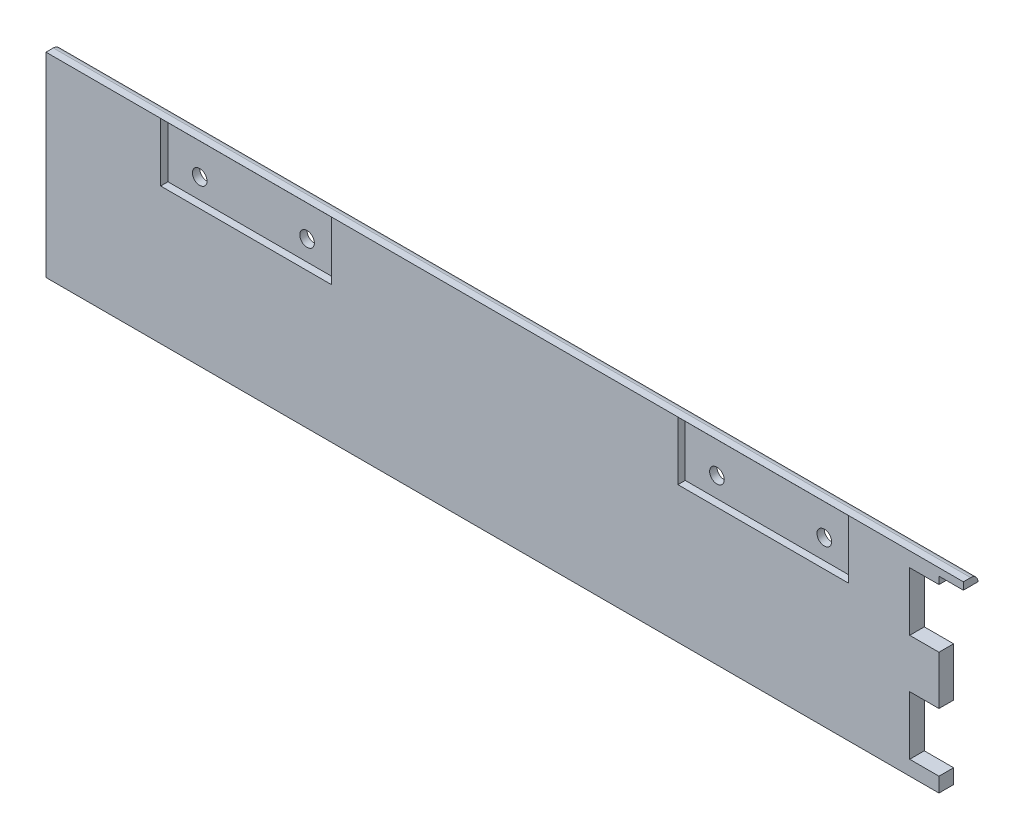
ISO-10303-21;
HEADER;
FILE_DESCRIPTION(('STEP AP214'),'2;1');
FILE_NAME('part.step','',(''),(''),'','','');
FILE_SCHEMA(('AUTOMOTIVE_DESIGN { 1 0 10303 214 1 1 1 1 }'));
ENDSEC;
DATA;
#1=APPLICATION_CONTEXT('core data for automotive mechanical design processes');
#2=APPLICATION_PROTOCOL_DEFINITION('international standard','automotive_design',2000,#1);
#3=PRODUCT_CONTEXT('',#1,'mechanical');
#4=PRODUCT('Part','Part','',(#3));
#5=PRODUCT_RELATED_PRODUCT_CATEGORY('part','',(#4));
#6=PRODUCT_DEFINITION_FORMATION('','',#4);
#7=PRODUCT_DEFINITION_CONTEXT('part definition',#1,'design');
#8=PRODUCT_DEFINITION('design','',#6,#7);
#9=PRODUCT_DEFINITION_SHAPE('','',#8);
#10=(LENGTH_UNIT() NAMED_UNIT(*) SI_UNIT(.MILLI.,.METRE.));
#11=(NAMED_UNIT(*) PLANE_ANGLE_UNIT() SI_UNIT($,.RADIAN.));
#12=(NAMED_UNIT(*) SI_UNIT($,.STERADIAN.) SOLID_ANGLE_UNIT());
#13=UNCERTAINTY_MEASURE_WITH_UNIT(LENGTH_MEASURE(1.E-05),#10,'distance_accuracy_value','');
#14=(GEOMETRIC_REPRESENTATION_CONTEXT(3) GLOBAL_UNCERTAINTY_ASSIGNED_CONTEXT((#13)) GLOBAL_UNIT_ASSIGNED_CONTEXT((#10,
#11,#12)) REPRESENTATION_CONTEXT('',''));
#15=CARTESIAN_POINT('',(0.,0.,0.));
#16=DIRECTION('',(0.,0.,1.));
#17=DIRECTION('',(1.,0.,0.));
#18=AXIS2_PLACEMENT_3D('',#15,#16,#17);
#19=CARTESIAN_POINT('',(0.,0.,3.));
#20=DIRECTION('',(1.,0.,0.));
#21=DIRECTION('',(0.,0.,-1.));
#22=AXIS2_PLACEMENT_3D('',#19,#20,#21);
#23=PLANE('',#22);
#24=DIRECTION('',(0.,0.,-1.));
#25=VECTOR('',#24,1.);
#26=CARTESIAN_POINT('',(0.,40.,3.));
#27=LINE('',#26,#25);
#28=CARTESIAN_POINT('',(0.,40.,3.));
#29=VERTEX_POINT('',#28);
#30=CARTESIAN_POINT('',(0.,40.,1.5));
#31=VERTEX_POINT('',#30);
#32=EDGE_CURVE('E350',#29,#31,#27,.T.);
#33=ORIENTED_EDGE('',*,*,#32,.T.);
#34=CARTESIAN_POINT('',(0.,38.5,1.5));
#35=DIRECTION('',(1.,0.,0.));
#36=DIRECTION('',(0.,0.,-1.));
#37=AXIS2_PLACEMENT_3D('',#34,#35,#36);
#38=CIRCLE('',#37,1.5);
#39=CARTESIAN_POINT('',(0.,38.5,0.));
#40=VERTEX_POINT('',#39);
#41=EDGE_CURVE('E365',#31,#40,#38,.F.);
#42=ORIENTED_EDGE('',*,*,#41,.T.);
#43=DIRECTION('',(0.,-1.,0.));
#44=VECTOR('',#43,1.);
#45=CARTESIAN_POINT('',(0.,0.,0.));
#46=LINE('',#45,#44);
#47=CARTESIAN_POINT('',(0.,0.,0.));
#48=VERTEX_POINT('',#47);
#49=EDGE_CURVE('E317',#40,#48,#46,.T.);
#50=ORIENTED_EDGE('',*,*,#49,.T.);
#51=DIRECTION('',(0.,0.,-1.));
#52=VECTOR('',#51,1.);
#53=CARTESIAN_POINT('',(0.,0.,3.));
#54=LINE('',#53,#52);
#55=CARTESIAN_POINT('',(0.,0.,3.));
#56=VERTEX_POINT('',#55);
#57=EDGE_CURVE('E359',#56,#48,#54,.T.);
#58=ORIENTED_EDGE('',*,*,#57,.F.);
#59=DIRECTION('',(0.,-1.,0.));
#60=VECTOR('',#59,1.);
#61=CARTESIAN_POINT('',(0.,0.,3.));
#62=LINE('',#61,#60);
#63=EDGE_CURVE('E339',#29,#56,#62,.T.);
#64=ORIENTED_EDGE('',*,*,#63,.F.);
#65=EDGE_LOOP('',(#33,#42,#50,#58,#64));
#66=FACE_BOUND('',#65,.T.);
#67=ADVANCED_FACE('F33',(#66),#23,.F.);
#68=CARTESIAN_POINT('',(0.,0.,3.));
#69=DIRECTION('',(0.,1.,0.));
#70=DIRECTION('',(0.,0.,1.));
#71=AXIS2_PLACEMENT_3D('',#68,#69,#70);
#72=PLANE('',#71);
#73=DIRECTION('',(1.,0.,0.));
#74=VECTOR('',#73,1.);
#75=CARTESIAN_POINT('',(0.,0.,0.));
#76=LINE('',#75,#74);
#77=CARTESIAN_POINT('',(183.,0.,0.));
#78=VERTEX_POINT('',#77);
#79=EDGE_CURVE('E343',#48,#78,#76,.T.);
#80=ORIENTED_EDGE('',*,*,#79,.T.);
#81=DIRECTION('',(0.,0.,-1.));
#82=VECTOR('',#81,1.);
#83=CARTESIAN_POINT('',(183.,0.,3.));
#84=LINE('',#83,#82);
#85=CARTESIAN_POINT('',(183.,0.,3.));
#86=VERTEX_POINT('',#85);
#87=EDGE_CURVE('E328',#86,#78,#84,.T.);
#88=ORIENTED_EDGE('',*,*,#87,.F.);
#89=DIRECTION('',(1.,0.,0.));
#90=VECTOR('',#89,1.);
#91=CARTESIAN_POINT('',(0.,0.,3.));
#92=LINE('',#91,#90);
#93=EDGE_CURVE('E342',#56,#86,#92,.T.);
#94=ORIENTED_EDGE('',*,*,#93,.F.);
#95=ORIENTED_EDGE('',*,*,#57,.T.);
#96=EDGE_LOOP('',(#80,#88,#94,#95));
#97=FACE_BOUND('',#96,.T.);
#98=ADVANCED_FACE('F423',(#97),#72,.F.);
#99=CARTESIAN_POINT('',(188.,0.,3.));
#100=DIRECTION('',(-1.,0.,0.));
#101=DIRECTION('',(0.,0.,1.));
#102=AXIS2_PLACEMENT_3D('',#99,#100,#101);
#103=PLANE('',#102);
#104=DIRECTION('',(0.,1.,0.));
#105=VECTOR('',#104,1.);
#106=CARTESIAN_POINT('',(188.,0.,3.));
#107=LINE('',#106,#105);
#108=CARTESIAN_POINT('',(188.,38.5,3.));
#109=VERTEX_POINT('',#108);
#110=CARTESIAN_POINT('',(188.,40.,3.));
#111=VERTEX_POINT('',#110);
#112=EDGE_CURVE('E346',#109,#111,#107,.T.);
#113=ORIENTED_EDGE('',*,*,#112,.F.);
#114=DIRECTION('',(0.,0.,-1.));
#115=VECTOR('',#114,1.);
#116=CARTESIAN_POINT('',(188.,38.5,3.));
#117=LINE('',#116,#115);
#118=CARTESIAN_POINT('',(188.,38.5,0.));
#119=VERTEX_POINT('',#118);
#120=EDGE_CURVE('E330',#109,#119,#117,.T.);
#121=ORIENTED_EDGE('',*,*,#120,.T.);
#122=CARTESIAN_POINT('',(188.,38.5,1.5));
#123=DIRECTION('',(-1.,0.,0.));
#124=DIRECTION('',(0.,0.,1.));
#125=AXIS2_PLACEMENT_3D('',#122,#123,#124);
#126=CIRCLE('',#125,1.5);
#127=CARTESIAN_POINT('',(188.,40.,1.5));
#128=VERTEX_POINT('',#127);
#129=EDGE_CURVE('E11',#119,#128,#126,.F.);
#130=ORIENTED_EDGE('',*,*,#129,.T.);
#131=DIRECTION('',(0.,0.,-1.));
#132=VECTOR('',#131,1.);
#133=CARTESIAN_POINT('',(188.,40.,3.));
#134=LINE('',#133,#132);
#135=EDGE_CURVE('E356',#111,#128,#134,.T.);
#136=ORIENTED_EDGE('',*,*,#135,.F.);
#137=EDGE_LOOP('',(#113,#121,#130,#136));
#138=FACE_BOUND('',#137,.T.);
#139=ADVANCED_FACE('F384',(#138),#103,.F.);
#140=CARTESIAN_POINT('',(0.,40.,3.));
#141=DIRECTION('',(0.,-1.,0.));
#142=DIRECTION('',(0.,0.,-1.));
#143=AXIS2_PLACEMENT_3D('',#140,#141,#142);
#144=PLANE('',#143);
#145=ORIENTED_EDGE('',*,*,#135,.T.);
#146=DIRECTION('',(-1.,0.,0.));
#147=VECTOR('',#146,1.);
#148=CARTESIAN_POINT('',(0.,40.,1.5));
#149=LINE('',#148,#147);
#150=EDGE_CURVE('E362',#128,#31,#149,.T.);
#151=ORIENTED_EDGE('',*,*,#150,.T.);
#152=ORIENTED_EDGE('',*,*,#32,.F.);
#153=DIRECTION('',(-1.,0.,0.));
#154=VECTOR('',#153,1.);
#155=CARTESIAN_POINT('',(0.,40.,3.));
#156=LINE('',#155,#154);
#157=EDGE_CURVE('E348',#111,#29,#156,.T.);
#158=ORIENTED_EDGE('',*,*,#157,.F.);
#159=EDGE_LOOP('',(#145,#151,#152,#158));
#160=FACE_BOUND('',#159,.T.);
#161=ADVANCED_FACE('F428',(#160),#144,.F.);
#162=CARTESIAN_POINT('',(0.,0.,3.));
#163=DIRECTION('',(0.,0.,-1.));
#164=DIRECTION('',(-1.,0.,0.));
#165=AXIS2_PLACEMENT_3D('',#162,#163,#164);
#166=PLANE('',#165);
#167=DIRECTION('',(1.,0.,0.));
#168=VECTOR('',#167,1.);
#169=CARTESIAN_POINT('',(23.5,27.99,3.));
#170=LINE('',#169,#168);
#171=CARTESIAN_POINT('',(23.5,27.99,3.));
#172=VERTEX_POINT('',#171);
#173=CARTESIAN_POINT('',(58.5,27.99,3.));
#174=VERTEX_POINT('',#173);
#175=EDGE_CURVE('E216',#172,#174,#170,.T.);
#176=ORIENTED_EDGE('',*,*,#175,.F.);
#177=DIRECTION('',(0.,-1.,0.));
#178=VECTOR('',#177,1.);
#179=CARTESIAN_POINT('',(23.5,27.99,3.));
#180=LINE('',#179,#178);
#181=CARTESIAN_POINT('',(23.5,39.99,3.));
#182=VERTEX_POINT('',#181);
#183=EDGE_CURVE('E48',#182,#172,#180,.T.);
#184=ORIENTED_EDGE('',*,*,#183,.F.);
#185=DIRECTION('',(-1.,0.,0.));
#186=VECTOR('',#185,1.);
#187=CARTESIAN_POINT('',(23.5,39.99,3.));
#188=LINE('',#187,#186);
#189=CARTESIAN_POINT('',(58.5,39.99,3.));
#190=VERTEX_POINT('',#189);
#191=EDGE_CURVE('E204',#190,#182,#188,.T.);
#192=ORIENTED_EDGE('',*,*,#191,.F.);
#193=DIRECTION('',(0.,1.,0.));
#194=VECTOR('',#193,1.);
#195=CARTESIAN_POINT('',(58.5,27.99,3.));
#196=LINE('',#195,#194);
#197=EDGE_CURVE('E207',#174,#190,#196,.T.);
#198=ORIENTED_EDGE('',*,*,#197,.F.);
#199=EDGE_LOOP('',(#176,#184,#192,#198));
#200=FACE_BOUND('',#199,.T.);
#201=DIRECTION('',(1.,0.,0.));
#202=VECTOR('',#201,1.);
#203=CARTESIAN_POINT('',(129.5,27.99,3.));
#204=LINE('',#203,#202);
#205=CARTESIAN_POINT('',(129.5,27.99,3.));
#206=VERTEX_POINT('',#205);
#207=CARTESIAN_POINT('',(164.5,27.99,3.));
#208=VERTEX_POINT('',#207);
#209=EDGE_CURVE('E241',#206,#208,#204,.T.);
#210=ORIENTED_EDGE('',*,*,#209,.F.);
#211=DIRECTION('',(0.,-1.,0.));
#212=VECTOR('',#211,1.);
#213=CARTESIAN_POINT('',(129.5,27.99,3.));
#214=LINE('',#213,#212);
#215=CARTESIAN_POINT('',(129.5,39.99,3.));
#216=VERTEX_POINT('',#215);
#217=EDGE_CURVE('E56',#216,#206,#214,.T.);
#218=ORIENTED_EDGE('',*,*,#217,.F.);
#219=DIRECTION('',(-1.,0.,0.));
#220=VECTOR('',#219,1.);
#221=CARTESIAN_POINT('',(129.5,39.99,3.));
#222=LINE('',#221,#220);
#223=CARTESIAN_POINT('',(164.5,39.99,3.));
#224=VERTEX_POINT('',#223);
#225=EDGE_CURVE('E230',#224,#216,#222,.T.);
#226=ORIENTED_EDGE('',*,*,#225,.F.);
#227=DIRECTION('',(0.,1.,0.));
#228=VECTOR('',#227,1.);
#229=CARTESIAN_POINT('',(164.5,27.99,3.));
#230=LINE('',#229,#228);
#231=EDGE_CURVE('E244',#208,#224,#230,.T.);
#232=ORIENTED_EDGE('',*,*,#231,.F.);
#233=EDGE_LOOP('',(#210,#218,#226,#232));
#234=FACE_BOUND('',#233,.T.);
#235=ORIENTED_EDGE('',*,*,#93,.T.);
#236=DIRECTION('',(0.,1.,0.));
#237=VECTOR('',#236,1.);
#238=CARTESIAN_POINT('',(183.,3.,3.));
#239=LINE('',#238,#237);
#240=CARTESIAN_POINT('',(183.,3.,3.));
#241=VERTEX_POINT('',#240);
#242=EDGE_CURVE('E270',#86,#241,#239,.T.);
#243=ORIENTED_EDGE('',*,*,#242,.T.);
#244=DIRECTION('',(-1.,0.,0.));
#245=VECTOR('',#244,1.);
#246=CARTESIAN_POINT('',(177.,3.,3.));
#247=LINE('',#246,#245);
#248=CARTESIAN_POINT('',(177.,3.,3.));
#249=VERTEX_POINT('',#248);
#250=EDGE_CURVE('E273',#241,#249,#247,.T.);
#251=ORIENTED_EDGE('',*,*,#250,.T.);
#252=DIRECTION('',(0.,1.,0.));
#253=VECTOR('',#252,1.);
#254=CARTESIAN_POINT('',(177.,15.,3.));
#255=LINE('',#254,#253);
#256=CARTESIAN_POINT('',(177.,15.,3.));
#257=VERTEX_POINT('',#256);
#258=EDGE_CURVE('E276',#249,#257,#255,.T.);
#259=ORIENTED_EDGE('',*,*,#258,.T.);
#260=DIRECTION('',(1.,0.,0.));
#261=VECTOR('',#260,1.);
#262=CARTESIAN_POINT('',(177.,15.,3.));
#263=LINE('',#262,#261);
#264=CARTESIAN_POINT('',(183.,15.,3.));
#265=VERTEX_POINT('',#264);
#266=EDGE_CURVE('E279',#257,#265,#263,.T.);
#267=ORIENTED_EDGE('',*,*,#266,.T.);
#268=DIRECTION('',(0.,1.,0.));
#269=VECTOR('',#268,1.);
#270=CARTESIAN_POINT('',(183.,25.,3.));
#271=LINE('',#270,#269);
#272=CARTESIAN_POINT('',(183.,25.,3.));
#273=VERTEX_POINT('',#272);
#274=EDGE_CURVE('E282',#265,#273,#271,.T.);
#275=ORIENTED_EDGE('',*,*,#274,.T.);
#276=DIRECTION('',(-1.,0.,0.));
#277=VECTOR('',#276,1.);
#278=CARTESIAN_POINT('',(177.,25.,3.));
#279=LINE('',#278,#277);
#280=CARTESIAN_POINT('',(177.,25.,3.));
#281=VERTEX_POINT('',#280);
#282=EDGE_CURVE('E285',#273,#281,#279,.T.);
#283=ORIENTED_EDGE('',*,*,#282,.T.);
#284=DIRECTION('',(0.,1.,0.));
#285=VECTOR('',#284,1.);
#286=CARTESIAN_POINT('',(177.,37.,3.));
#287=LINE('',#286,#285);
#288=CARTESIAN_POINT('',(177.,37.,3.));
#289=VERTEX_POINT('',#288);
#290=EDGE_CURVE('E257',#281,#289,#287,.T.);
#291=ORIENTED_EDGE('',*,*,#290,.T.);
#292=DIRECTION('',(1.,0.,0.));
#293=VECTOR('',#292,1.);
#294=CARTESIAN_POINT('',(177.,37.,3.));
#295=LINE('',#294,#293);
#296=CARTESIAN_POINT('',(183.,37.,3.));
#297=VERTEX_POINT('',#296);
#298=EDGE_CURVE('E260',#289,#297,#295,.T.);
#299=ORIENTED_EDGE('',*,*,#298,.T.);
#300=DIRECTION('',(0.,1.,0.));
#301=VECTOR('',#300,1.);
#302=CARTESIAN_POINT('',(183.,37.,3.));
#303=LINE('',#302,#301);
#304=CARTESIAN_POINT('',(183.,38.5,3.));
#305=VERTEX_POINT('',#304);
#306=EDGE_CURVE('E264',#297,#305,#303,.T.);
#307=ORIENTED_EDGE('',*,*,#306,.T.);
#308=DIRECTION('',(1.,0.,0.));
#309=VECTOR('',#308,1.);
#310=CARTESIAN_POINT('',(183.,38.5,3.));
#311=LINE('',#310,#309);
#312=EDGE_CURVE('E267',#305,#109,#311,.T.);
#313=ORIENTED_EDGE('',*,*,#312,.T.);
#314=ORIENTED_EDGE('',*,*,#112,.T.);
#315=ORIENTED_EDGE('',*,*,#157,.T.);
#316=ORIENTED_EDGE('',*,*,#63,.T.);
#317=EDGE_LOOP('',(#235,#243,#251,#259,#267,#275,#283,#291,#299,#307,#313,#314,#315,#316));
#318=FACE_BOUND('',#317,.T.);
#319=ADVANCED_FACE('F388',(#200,#234,#318),#166,.F.);
#320=CARTESIAN_POINT('',(0.,0.,0.));
#321=DIRECTION('',(0.,0.,-1.));
#322=DIRECTION('',(-1.,0.,0.));
#323=AXIS2_PLACEMENT_3D('',#320,#321,#322);
#324=PLANE('',#323);
#325=CARTESIAN_POINT('',(158.,32.1,0.));
#326=DIRECTION('',(0.,0.,1.));
#327=DIRECTION('',(1.,0.,0.));
#328=AXIS2_PLACEMENT_3D('',#325,#326,#327);
#329=CIRCLE('',#328,1.5);
#330=CARTESIAN_POINT('',(159.5,32.1,0.));
#331=VERTEX_POINT('',#330);
#332=EDGE_CURVE('E694',#331,#331,#329,.T.);
#333=ORIENTED_EDGE('',*,*,#332,.T.);
#334=EDGE_LOOP('',(#333));
#335=FACE_BOUND('',#334,.T.);
#336=CARTESIAN_POINT('',(136.,32.1,0.));
#337=DIRECTION('',(0.,0.,1.));
#338=DIRECTION('',(1.,0.,0.));
#339=AXIS2_PLACEMENT_3D('',#336,#337,#338);
#340=CIRCLE('',#339,1.5);
#341=CARTESIAN_POINT('',(137.5,32.1,0.));
#342=VERTEX_POINT('',#341);
#343=EDGE_CURVE('E702',#342,#342,#340,.T.);
#344=ORIENTED_EDGE('',*,*,#343,.T.);
#345=EDGE_LOOP('',(#344));
#346=FACE_BOUND('',#345,.T.);
#347=CARTESIAN_POINT('',(52.,32.1,0.));
#348=DIRECTION('',(0.,0.,1.));
#349=DIRECTION('',(1.,0.,0.));
#350=AXIS2_PLACEMENT_3D('',#347,#348,#349);
#351=CIRCLE('',#350,1.5);
#352=CARTESIAN_POINT('',(53.5,32.1,0.));
#353=VERTEX_POINT('',#352);
#354=EDGE_CURVE('E708',#353,#353,#351,.T.);
#355=ORIENTED_EDGE('',*,*,#354,.T.);
#356=EDGE_LOOP('',(#355));
#357=FACE_BOUND('',#356,.T.);
#358=CARTESIAN_POINT('',(30.,32.1,0.));
#359=DIRECTION('',(0.,0.,1.));
#360=DIRECTION('',(1.,0.,0.));
#361=AXIS2_PLACEMENT_3D('',#358,#359,#360);
#362=CIRCLE('',#361,1.50000000000001);
#363=CARTESIAN_POINT('',(31.5,32.1,0.));
#364=VERTEX_POINT('',#363);
#365=EDGE_CURVE('E217',#364,#364,#362,.T.);
#366=ORIENTED_EDGE('',*,*,#365,.T.);
#367=EDGE_LOOP('',(#366));
#368=FACE_BOUND('',#367,.T.);
#369=DIRECTION('',(0.,1.,0.));
#370=VECTOR('',#369,1.);
#371=CARTESIAN_POINT('',(183.,3.,0.));
#372=LINE('',#371,#370);
#373=CARTESIAN_POINT('',(183.,3.,0.));
#374=VERTEX_POINT('',#373);
#375=EDGE_CURVE('E298',#78,#374,#372,.T.);
#376=ORIENTED_EDGE('',*,*,#375,.F.);
#377=ORIENTED_EDGE('',*,*,#79,.F.);
#378=ORIENTED_EDGE('',*,*,#49,.F.);
#379=DIRECTION('',(-1.,0.,0.));
#380=VECTOR('',#379,1.);
#381=CARTESIAN_POINT('',(188.,38.5,0.));
#382=LINE('',#381,#380);
#383=CARTESIAN_POINT('',(183.,38.5,0.));
#384=VERTEX_POINT('',#383);
#385=EDGE_CURVE('E41',#40,#384,#382,.F.);
#386=ORIENTED_EDGE('',*,*,#385,.T.);
#387=DIRECTION('',(0.,1.,0.));
#388=VECTOR('',#387,1.);
#389=CARTESIAN_POINT('',(183.,37.,0.));
#390=LINE('',#389,#388);
#391=CARTESIAN_POINT('',(183.,37.,0.));
#392=VERTEX_POINT('',#391);
#393=EDGE_CURVE('E294',#392,#384,#390,.T.);
#394=ORIENTED_EDGE('',*,*,#393,.F.);
#395=DIRECTION('',(1.,0.,0.));
#396=VECTOR('',#395,1.);
#397=CARTESIAN_POINT('',(177.,37.,0.));
#398=LINE('',#397,#396);
#399=CARTESIAN_POINT('',(177.,37.,0.));
#400=VERTEX_POINT('',#399);
#401=EDGE_CURVE('E291',#400,#392,#398,.T.);
#402=ORIENTED_EDGE('',*,*,#401,.F.);
#403=DIRECTION('',(0.,1.,0.));
#404=VECTOR('',#403,1.);
#405=CARTESIAN_POINT('',(177.,37.,0.));
#406=LINE('',#405,#404);
#407=CARTESIAN_POINT('',(177.,25.,0.));
#408=VERTEX_POINT('',#407);
#409=EDGE_CURVE('E251',#408,#400,#406,.T.);
#410=ORIENTED_EDGE('',*,*,#409,.F.);
#411=DIRECTION('',(-1.,0.,0.));
#412=VECTOR('',#411,1.);
#413=CARTESIAN_POINT('',(177.,25.,0.));
#414=LINE('',#413,#412);
#415=CARTESIAN_POINT('',(183.,25.,0.));
#416=VERTEX_POINT('',#415);
#417=EDGE_CURVE('E261',#416,#408,#414,.T.);
#418=ORIENTED_EDGE('',*,*,#417,.F.);
#419=DIRECTION('',(0.,1.,0.));
#420=VECTOR('',#419,1.);
#421=CARTESIAN_POINT('',(183.,25.,0.));
#422=LINE('',#421,#420);
#423=CARTESIAN_POINT('',(183.,15.,0.));
#424=VERTEX_POINT('',#423);
#425=EDGE_CURVE('E310',#424,#416,#422,.T.);
#426=ORIENTED_EDGE('',*,*,#425,.F.);
#427=DIRECTION('',(1.,0.,0.));
#428=VECTOR('',#427,1.);
#429=CARTESIAN_POINT('',(177.,15.,0.));
#430=LINE('',#429,#428);
#431=CARTESIAN_POINT('',(177.,15.,0.));
#432=VERTEX_POINT('',#431);
#433=EDGE_CURVE('E307',#432,#424,#430,.T.);
#434=ORIENTED_EDGE('',*,*,#433,.F.);
#435=DIRECTION('',(0.,1.,0.));
#436=VECTOR('',#435,1.);
#437=CARTESIAN_POINT('',(177.,15.,0.));
#438=LINE('',#437,#436);
#439=CARTESIAN_POINT('',(177.,3.,0.));
#440=VERTEX_POINT('',#439);
#441=EDGE_CURVE('E304',#440,#432,#438,.T.);
#442=ORIENTED_EDGE('',*,*,#441,.F.);
#443=DIRECTION('',(-1.,0.,0.));
#444=VECTOR('',#443,1.);
#445=CARTESIAN_POINT('',(177.,3.,0.));
#446=LINE('',#445,#444);
#447=EDGE_CURVE('E301',#374,#440,#446,.T.);
#448=ORIENTED_EDGE('',*,*,#447,.F.);
#449=EDGE_LOOP('',(#376,#377,#378,#386,#394,#402,#410,#418,#426,#434,#442,#448));
#450=FACE_BOUND('',#449,.T.);
#451=ADVANCED_FACE('F372',(#335,#346,#357,#368,#450),#324,.T.);
#452=CARTESIAN_POINT('',(0.,38.5,1.5));
#453=DIRECTION('',(1.,0.,0.));
#454=DIRECTION('',(0.,0.,-1.));
#455=AXIS2_PLACEMENT_3D('',#452,#453,#454);
#456=CYLINDRICAL_SURFACE('',#455,1.5);
#457=ORIENTED_EDGE('',*,*,#129,.F.);
#458=DIRECTION('',(1.,0.,0.));
#459=VECTOR('',#458,1.);
#460=CARTESIAN_POINT('',(183.,38.5,0.));
#461=LINE('',#460,#459);
#462=EDGE_CURVE('E296',#384,#119,#461,.T.);
#463=ORIENTED_EDGE('',*,*,#462,.F.);
#464=ORIENTED_EDGE('',*,*,#385,.F.);
#465=ORIENTED_EDGE('',*,*,#41,.F.);
#466=ORIENTED_EDGE('',*,*,#150,.F.);
#467=EDGE_LOOP('',(#457,#463,#464,#465,#466));
#468=FACE_BOUND('',#467,.T.);
#469=ADVANCED_FACE('F35',(#468),#456,.T.);
#470=CARTESIAN_POINT('',(177.,37.,3.));
#471=DIRECTION('',(-1.,0.,0.));
#472=DIRECTION('',(0.,0.,1.));
#473=AXIS2_PLACEMENT_3D('',#470,#471,#472);
#474=PLANE('',#473);
#475=ORIENTED_EDGE('',*,*,#409,.T.);
#476=DIRECTION('',(0.,0.,-1.));
#477=VECTOR('',#476,1.);
#478=CARTESIAN_POINT('',(177.,37.,3.));
#479=LINE('',#478,#477);
#480=EDGE_CURVE('E288',#289,#400,#479,.T.);
#481=ORIENTED_EDGE('',*,*,#480,.F.);
#482=ORIENTED_EDGE('',*,*,#290,.F.);
#483=DIRECTION('',(0.,0.,-1.));
#484=VECTOR('',#483,1.);
#485=CARTESIAN_POINT('',(177.,25.,3.));
#486=LINE('',#485,#484);
#487=EDGE_CURVE('E315',#281,#408,#486,.T.);
#488=ORIENTED_EDGE('',*,*,#487,.T.);
#489=EDGE_LOOP('',(#475,#481,#482,#488));
#490=FACE_BOUND('',#489,.T.);
#491=ADVANCED_FACE('F400',(#490),#474,.F.);
#492=CARTESIAN_POINT('',(177.,25.,3.));
#493=DIRECTION('',(0.,-1.,0.));
#494=DIRECTION('',(0.,0.,-1.));
#495=AXIS2_PLACEMENT_3D('',#492,#493,#494);
#496=PLANE('',#495);
#497=ORIENTED_EDGE('',*,*,#417,.T.);
#498=ORIENTED_EDGE('',*,*,#487,.F.);
#499=ORIENTED_EDGE('',*,*,#282,.F.);
#500=DIRECTION('',(0.,0.,-1.));
#501=VECTOR('',#500,1.);
#502=CARTESIAN_POINT('',(183.,25.,3.));
#503=LINE('',#502,#501);
#504=EDGE_CURVE('E318',#273,#416,#503,.T.);
#505=ORIENTED_EDGE('',*,*,#504,.T.);
#506=EDGE_LOOP('',(#497,#498,#499,#505));
#507=FACE_BOUND('',#506,.T.);
#508=ADVANCED_FACE('F404',(#507),#496,.F.);
#509=CARTESIAN_POINT('',(183.,25.,3.));
#510=DIRECTION('',(-1.,0.,0.));
#511=DIRECTION('',(0.,0.,1.));
#512=AXIS2_PLACEMENT_3D('',#509,#510,#511);
#513=PLANE('',#512);
#514=ORIENTED_EDGE('',*,*,#425,.T.);
#515=ORIENTED_EDGE('',*,*,#504,.F.);
#516=ORIENTED_EDGE('',*,*,#274,.F.);
#517=DIRECTION('',(0.,0.,-1.));
#518=VECTOR('',#517,1.);
#519=CARTESIAN_POINT('',(183.,15.,3.));
#520=LINE('',#519,#518);
#521=EDGE_CURVE('E320',#265,#424,#520,.T.);
#522=ORIENTED_EDGE('',*,*,#521,.T.);
#523=EDGE_LOOP('',(#514,#515,#516,#522));
#524=FACE_BOUND('',#523,.T.);
#525=ADVANCED_FACE('F407',(#524),#513,.F.);
#526=CARTESIAN_POINT('',(177.,15.,3.));
#527=DIRECTION('',(0.,1.,0.));
#528=DIRECTION('',(0.,0.,1.));
#529=AXIS2_PLACEMENT_3D('',#526,#527,#528);
#530=PLANE('',#529);
#531=ORIENTED_EDGE('',*,*,#433,.T.);
#532=ORIENTED_EDGE('',*,*,#521,.F.);
#533=ORIENTED_EDGE('',*,*,#266,.F.);
#534=DIRECTION('',(0.,0.,-1.));
#535=VECTOR('',#534,1.);
#536=CARTESIAN_POINT('',(177.,15.,3.));
#537=LINE('',#536,#535);
#538=EDGE_CURVE('E322',#257,#432,#537,.T.);
#539=ORIENTED_EDGE('',*,*,#538,.T.);
#540=EDGE_LOOP('',(#531,#532,#533,#539));
#541=FACE_BOUND('',#540,.T.);
#542=ADVANCED_FACE('F412',(#541),#530,.F.);
#543=CARTESIAN_POINT('',(177.,15.,3.));
#544=DIRECTION('',(-1.,0.,0.));
#545=DIRECTION('',(0.,0.,1.));
#546=AXIS2_PLACEMENT_3D('',#543,#544,#545);
#547=PLANE('',#546);
#548=ORIENTED_EDGE('',*,*,#441,.T.);
#549=ORIENTED_EDGE('',*,*,#538,.F.);
#550=ORIENTED_EDGE('',*,*,#258,.F.);
#551=DIRECTION('',(0.,0.,-1.));
#552=VECTOR('',#551,1.);
#553=CARTESIAN_POINT('',(177.,3.,3.));
#554=LINE('',#553,#552);
#555=EDGE_CURVE('E324',#249,#440,#554,.T.);
#556=ORIENTED_EDGE('',*,*,#555,.T.);
#557=EDGE_LOOP('',(#548,#549,#550,#556));
#558=FACE_BOUND('',#557,.T.);
#559=ADVANCED_FACE('F416',(#558),#547,.F.);
#560=CARTESIAN_POINT('',(177.,3.,3.));
#561=DIRECTION('',(0.,-1.,0.));
#562=DIRECTION('',(1.,0.,0.));
#563=AXIS2_PLACEMENT_3D('',#560,#561,#562);
#564=PLANE('',#563);
#565=ORIENTED_EDGE('',*,*,#447,.T.);
#566=ORIENTED_EDGE('',*,*,#555,.F.);
#567=ORIENTED_EDGE('',*,*,#250,.F.);
#568=DIRECTION('',(0.,0.,-1.));
#569=VECTOR('',#568,1.);
#570=CARTESIAN_POINT('',(183.,3.,3.));
#571=LINE('',#570,#569);
#572=EDGE_CURVE('E326',#241,#374,#571,.T.);
#573=ORIENTED_EDGE('',*,*,#572,.T.);
#574=EDGE_LOOP('',(#565,#566,#567,#573));
#575=FACE_BOUND('',#574,.T.);
#576=ADVANCED_FACE('F419',(#575),#564,.F.);
#577=CARTESIAN_POINT('',(183.,3.,3.));
#578=DIRECTION('',(-1.,0.,0.));
#579=DIRECTION('',(0.,0.,1.));
#580=AXIS2_PLACEMENT_3D('',#577,#578,#579);
#581=PLANE('',#580);
#582=ORIENTED_EDGE('',*,*,#375,.T.);
#583=ORIENTED_EDGE('',*,*,#572,.F.);
#584=ORIENTED_EDGE('',*,*,#242,.F.);
#585=ORIENTED_EDGE('',*,*,#87,.T.);
#586=EDGE_LOOP('',(#582,#583,#584,#585));
#587=FACE_BOUND('',#586,.T.);
#588=ADVANCED_FACE('F509',(#587),#581,.F.);
#589=CARTESIAN_POINT('',(183.,38.5,3.));
#590=DIRECTION('',(0.,1.,0.));
#591=DIRECTION('',(0.,0.,1.));
#592=AXIS2_PLACEMENT_3D('',#589,#590,#591);
#593=PLANE('',#592);
#594=ORIENTED_EDGE('',*,*,#462,.T.);
#595=ORIENTED_EDGE('',*,*,#120,.F.);
#596=ORIENTED_EDGE('',*,*,#312,.F.);
#597=DIRECTION('',(0.,0.,-1.));
#598=VECTOR('',#597,1.);
#599=CARTESIAN_POINT('',(183.,38.5,3.));
#600=LINE('',#599,#598);
#601=EDGE_CURVE('E333',#305,#384,#600,.T.);
#602=ORIENTED_EDGE('',*,*,#601,.T.);
#603=EDGE_LOOP('',(#594,#595,#596,#602));
#604=FACE_BOUND('',#603,.T.);
#605=ADVANCED_FACE('F380',(#604),#593,.F.);
#606=CARTESIAN_POINT('',(183.,37.,3.));
#607=DIRECTION('',(-1.,0.,0.));
#608=DIRECTION('',(0.,0.,1.));
#609=AXIS2_PLACEMENT_3D('',#606,#607,#608);
#610=PLANE('',#609);
#611=ORIENTED_EDGE('',*,*,#393,.T.);
#612=ORIENTED_EDGE('',*,*,#601,.F.);
#613=ORIENTED_EDGE('',*,*,#306,.F.);
#614=DIRECTION('',(0.,0.,-1.));
#615=VECTOR('',#614,1.);
#616=CARTESIAN_POINT('',(183.,37.,3.));
#617=LINE('',#616,#615);
#618=EDGE_CURVE('E336',#297,#392,#617,.T.);
#619=ORIENTED_EDGE('',*,*,#618,.T.);
#620=EDGE_LOOP('',(#611,#612,#613,#619));
#621=FACE_BOUND('',#620,.T.);
#622=ADVANCED_FACE('F393',(#621),#610,.F.);
#623=CARTESIAN_POINT('',(177.,37.,3.));
#624=DIRECTION('',(0.,1.,0.));
#625=DIRECTION('',(0.,0.,1.));
#626=AXIS2_PLACEMENT_3D('',#623,#624,#625);
#627=PLANE('',#626);
#628=ORIENTED_EDGE('',*,*,#401,.T.);
#629=ORIENTED_EDGE('',*,*,#618,.F.);
#630=ORIENTED_EDGE('',*,*,#298,.F.);
#631=ORIENTED_EDGE('',*,*,#480,.T.);
#632=EDGE_LOOP('',(#628,#629,#630,#631));
#633=FACE_BOUND('',#632,.T.);
#634=ADVANCED_FACE('F395',(#633),#627,.F.);
#635=CARTESIAN_POINT('',(129.5,27.99,1.5));
#636=DIRECTION('',(-1.,0.,0.));
#637=DIRECTION('',(0.,0.,1.));
#638=AXIS2_PLACEMENT_3D('',#635,#636,#637);
#639=PLANE('',#638);
#640=ORIENTED_EDGE('',*,*,#217,.T.);
#641=DIRECTION('',(0.,0.,1.));
#642=VECTOR('',#641,1.);
#643=CARTESIAN_POINT('',(129.5,27.99,1.5));
#644=LINE('',#643,#642);
#645=CARTESIAN_POINT('',(129.5,27.99,1.5));
#646=VERTEX_POINT('',#645);
#647=EDGE_CURVE('E239',#646,#206,#644,.T.);
#648=ORIENTED_EDGE('',*,*,#647,.F.);
#649=DIRECTION('',(0.,-1.,0.));
#650=VECTOR('',#649,1.);
#651=CARTESIAN_POINT('',(129.5,27.99,1.5));
#652=LINE('',#651,#650);
#653=CARTESIAN_POINT('',(129.5,39.99,1.5));
#654=VERTEX_POINT('',#653);
#655=EDGE_CURVE('E226',#654,#646,#652,.T.);
#656=ORIENTED_EDGE('',*,*,#655,.F.);
#657=DIRECTION('',(0.,0.,1.));
#658=VECTOR('',#657,1.);
#659=CARTESIAN_POINT('',(129.5,39.99,1.5));
#660=LINE('',#659,#658);
#661=EDGE_CURVE('E249',#654,#216,#660,.T.);
#662=ORIENTED_EDGE('',*,*,#661,.T.);
#663=EDGE_LOOP('',(#640,#648,#656,#662));
#664=FACE_BOUND('',#663,.T.);
#665=ADVANCED_FACE('F542',(#664),#639,.F.);
#666=CARTESIAN_POINT('',(129.5,39.99,1.5));
#667=DIRECTION('',(0.,1.,0.));
#668=DIRECTION('',(0.,0.,1.));
#669=AXIS2_PLACEMENT_3D('',#666,#667,#668);
#670=PLANE('',#669);
#671=ORIENTED_EDGE('',*,*,#225,.T.);
#672=ORIENTED_EDGE('',*,*,#661,.F.);
#673=DIRECTION('',(-1.,0.,0.));
#674=VECTOR('',#673,1.);
#675=CARTESIAN_POINT('',(129.5,39.99,1.5));
#676=LINE('',#675,#674);
#677=CARTESIAN_POINT('',(164.5,39.99,1.5));
#678=VERTEX_POINT('',#677);
#679=EDGE_CURVE('E236',#678,#654,#676,.T.);
#680=ORIENTED_EDGE('',*,*,#679,.F.);
#681=DIRECTION('',(0.,0.,1.));
#682=VECTOR('',#681,1.);
#683=CARTESIAN_POINT('',(164.5,39.99,1.5));
#684=LINE('',#683,#682);
#685=EDGE_CURVE('E252',#678,#224,#684,.T.);
#686=ORIENTED_EDGE('',*,*,#685,.T.);
#687=EDGE_LOOP('',(#671,#672,#680,#686));
#688=FACE_BOUND('',#687,.T.);
#689=ADVANCED_FACE('F557',(#688),#670,.F.);
#690=CARTESIAN_POINT('',(164.5,27.99,1.5));
#691=DIRECTION('',(1.,0.,0.));
#692=DIRECTION('',(0.,0.,-1.));
#693=AXIS2_PLACEMENT_3D('',#690,#691,#692);
#694=PLANE('',#693);
#695=ORIENTED_EDGE('',*,*,#231,.T.);
#696=ORIENTED_EDGE('',*,*,#685,.F.);
#697=DIRECTION('',(0.,1.,0.));
#698=VECTOR('',#697,1.);
#699=CARTESIAN_POINT('',(164.5,27.99,1.5));
#700=LINE('',#699,#698);
#701=CARTESIAN_POINT('',(164.5,27.99,1.5));
#702=VERTEX_POINT('',#701);
#703=EDGE_CURVE('E233',#702,#678,#700,.T.);
#704=ORIENTED_EDGE('',*,*,#703,.F.);
#705=DIRECTION('',(0.,0.,1.));
#706=VECTOR('',#705,1.);
#707=CARTESIAN_POINT('',(164.5,27.99,1.5));
#708=LINE('',#707,#706);
#709=EDGE_CURVE('E254',#702,#208,#708,.T.);
#710=ORIENTED_EDGE('',*,*,#709,.T.);
#711=EDGE_LOOP('',(#695,#696,#704,#710));
#712=FACE_BOUND('',#711,.T.);
#713=ADVANCED_FACE('F566',(#712),#694,.F.);
#714=CARTESIAN_POINT('',(129.5,27.99,1.5));
#715=DIRECTION('',(0.,-1.,0.));
#716=DIRECTION('',(0.,0.,-1.));
#717=AXIS2_PLACEMENT_3D('',#714,#715,#716);
#718=PLANE('',#717);
#719=ORIENTED_EDGE('',*,*,#209,.T.);
#720=ORIENTED_EDGE('',*,*,#709,.F.);
#721=DIRECTION('',(1.,0.,0.));
#722=VECTOR('',#721,1.);
#723=CARTESIAN_POINT('',(129.5,27.99,1.5));
#724=LINE('',#723,#722);
#725=EDGE_CURVE('E229',#646,#702,#724,.T.);
#726=ORIENTED_EDGE('',*,*,#725,.F.);
#727=ORIENTED_EDGE('',*,*,#647,.T.);
#728=EDGE_LOOP('',(#719,#720,#726,#727));
#729=FACE_BOUND('',#728,.T.);
#730=ADVANCED_FACE('F576',(#729),#718,.F.);
#731=CARTESIAN_POINT('',(0.,0.,1.5));
#732=DIRECTION('',(0.,0.,-1.));
#733=DIRECTION('',(-1.,0.,0.));
#734=AXIS2_PLACEMENT_3D('',#731,#732,#733);
#735=PLANE('',#734);
#736=CARTESIAN_POINT('',(158.,32.1,1.5));
#737=DIRECTION('',(0.,0.,1.));
#738=DIRECTION('',(1.,0.,0.));
#739=AXIS2_PLACEMENT_3D('',#736,#737,#738);
#740=CIRCLE('',#739,1.5);
#741=CARTESIAN_POINT('',(159.5,32.1,1.5));
#742=VERTEX_POINT('',#741);
#743=EDGE_CURVE('E697',#742,#742,#740,.T.);
#744=ORIENTED_EDGE('',*,*,#743,.F.);
#745=EDGE_LOOP('',(#744));
#746=FACE_BOUND('',#745,.T.);
#747=CARTESIAN_POINT('',(136.,32.1,1.5));
#748=DIRECTION('',(0.,0.,1.));
#749=DIRECTION('',(1.,0.,0.));
#750=AXIS2_PLACEMENT_3D('',#747,#748,#749);
#751=CIRCLE('',#750,1.5);
#752=CARTESIAN_POINT('',(137.5,32.1,1.5));
#753=VERTEX_POINT('',#752);
#754=EDGE_CURVE('E699',#753,#753,#751,.T.);
#755=ORIENTED_EDGE('',*,*,#754,.F.);
#756=EDGE_LOOP('',(#755));
#757=FACE_BOUND('',#756,.T.);
#758=ORIENTED_EDGE('',*,*,#655,.T.);
#759=ORIENTED_EDGE('',*,*,#725,.T.);
#760=ORIENTED_EDGE('',*,*,#703,.T.);
#761=ORIENTED_EDGE('',*,*,#679,.T.);
#762=EDGE_LOOP('',(#758,#759,#760,#761));
#763=FACE_BOUND('',#762,.T.);
#764=ADVANCED_FACE('F586',(#746,#757,#763),#735,.F.);
#765=CARTESIAN_POINT('',(23.5,27.99,1.5));
#766=DIRECTION('',(-1.,0.,0.));
#767=DIRECTION('',(0.,0.,1.));
#768=AXIS2_PLACEMENT_3D('',#765,#766,#767);
#769=PLANE('',#768);
#770=ORIENTED_EDGE('',*,*,#183,.T.);
#771=DIRECTION('',(0.,0.,1.));
#772=VECTOR('',#771,1.);
#773=CARTESIAN_POINT('',(23.5,27.99,1.5));
#774=LINE('',#773,#772);
#775=CARTESIAN_POINT('',(23.5,27.99,1.5));
#776=VERTEX_POINT('',#775);
#777=EDGE_CURVE('E182',#776,#172,#774,.T.);
#778=ORIENTED_EDGE('',*,*,#777,.F.);
#779=DIRECTION('',(0.,-1.,0.));
#780=VECTOR('',#779,1.);
#781=CARTESIAN_POINT('',(23.5,27.99,1.5));
#782=LINE('',#781,#780);
#783=CARTESIAN_POINT('',(23.5,39.99,1.5));
#784=VERTEX_POINT('',#783);
#785=EDGE_CURVE('E186',#784,#776,#782,.T.);
#786=ORIENTED_EDGE('',*,*,#785,.F.);
#787=DIRECTION('',(0.,0.,1.));
#788=VECTOR('',#787,1.);
#789=CARTESIAN_POINT('',(23.5,39.99,1.5));
#790=LINE('',#789,#788);
#791=EDGE_CURVE('E221',#784,#182,#790,.T.);
#792=ORIENTED_EDGE('',*,*,#791,.T.);
#793=EDGE_LOOP('',(#770,#778,#786,#792));
#794=FACE_BOUND('',#793,.T.);
#795=ADVANCED_FACE('F184',(#794),#769,.F.);
#796=CARTESIAN_POINT('',(23.5,39.99,1.5));
#797=DIRECTION('',(0.,1.,0.));
#798=DIRECTION('',(0.,0.,1.));
#799=AXIS2_PLACEMENT_3D('',#796,#797,#798);
#800=PLANE('',#799);
#801=ORIENTED_EDGE('',*,*,#191,.T.);
#802=ORIENTED_EDGE('',*,*,#791,.F.);
#803=DIRECTION('',(-1.,0.,0.));
#804=VECTOR('',#803,1.);
#805=CARTESIAN_POINT('',(23.5,39.99,1.5));
#806=LINE('',#805,#804);
#807=CARTESIAN_POINT('',(58.5,39.99,1.5));
#808=VERTEX_POINT('',#807);
#809=EDGE_CURVE('E192',#808,#784,#806,.T.);
#810=ORIENTED_EDGE('',*,*,#809,.F.);
#811=DIRECTION('',(0.,0.,1.));
#812=VECTOR('',#811,1.);
#813=CARTESIAN_POINT('',(58.5,39.99,1.5));
#814=LINE('',#813,#812);
#815=EDGE_CURVE('E223',#808,#190,#814,.T.);
#816=ORIENTED_EDGE('',*,*,#815,.T.);
#817=EDGE_LOOP('',(#801,#802,#810,#816));
#818=FACE_BOUND('',#817,.T.);
#819=ADVANCED_FACE('F598',(#818),#800,.F.);
#820=CARTESIAN_POINT('',(58.5,27.99,1.5));
#821=DIRECTION('',(1.,0.,0.));
#822=DIRECTION('',(0.,0.,-1.));
#823=AXIS2_PLACEMENT_3D('',#820,#821,#822);
#824=PLANE('',#823);
#825=ORIENTED_EDGE('',*,*,#197,.T.);
#826=ORIENTED_EDGE('',*,*,#815,.F.);
#827=DIRECTION('',(0.,1.,0.));
#828=VECTOR('',#827,1.);
#829=CARTESIAN_POINT('',(58.5,27.99,1.5));
#830=LINE('',#829,#828);
#831=CARTESIAN_POINT('',(58.5,27.99,1.5));
#832=VERTEX_POINT('',#831);
#833=EDGE_CURVE('E200',#832,#808,#830,.T.);
#834=ORIENTED_EDGE('',*,*,#833,.F.);
#835=DIRECTION('',(0.,0.,1.));
#836=VECTOR('',#835,1.);
#837=CARTESIAN_POINT('',(58.5,27.99,1.5));
#838=LINE('',#837,#836);
#839=EDGE_CURVE('E191',#832,#174,#838,.T.);
#840=ORIENTED_EDGE('',*,*,#839,.T.);
#841=EDGE_LOOP('',(#825,#826,#834,#840));
#842=FACE_BOUND('',#841,.T.);
#843=ADVANCED_FACE('F607',(#842),#824,.F.);
#844=CARTESIAN_POINT('',(23.5,27.99,1.5));
#845=DIRECTION('',(0.,-1.,0.));
#846=DIRECTION('',(0.,0.,-1.));
#847=AXIS2_PLACEMENT_3D('',#844,#845,#846);
#848=PLANE('',#847);
#849=ORIENTED_EDGE('',*,*,#175,.T.);
#850=ORIENTED_EDGE('',*,*,#839,.F.);
#851=DIRECTION('',(1.,0.,0.));
#852=VECTOR('',#851,1.);
#853=CARTESIAN_POINT('',(23.5,27.99,1.5));
#854=LINE('',#853,#852);
#855=EDGE_CURVE('E195',#776,#832,#854,.T.);
#856=ORIENTED_EDGE('',*,*,#855,.F.);
#857=ORIENTED_EDGE('',*,*,#777,.T.);
#858=EDGE_LOOP('',(#849,#850,#856,#857));
#859=FACE_BOUND('',#858,.T.);
#860=ADVANCED_FACE('F196',(#859),#848,.F.);
#861=CARTESIAN_POINT('',(0.,0.,1.5));
#862=DIRECTION('',(0.,0.,-1.));
#863=DIRECTION('',(-1.,0.,0.));
#864=AXIS2_PLACEMENT_3D('',#861,#862,#863);
#865=PLANE('',#864);
#866=CARTESIAN_POINT('',(52.,32.1,1.5));
#867=DIRECTION('',(0.,0.,1.));
#868=DIRECTION('',(1.,0.,0.));
#869=AXIS2_PLACEMENT_3D('',#866,#867,#868);
#870=CIRCLE('',#869,1.5);
#871=CARTESIAN_POINT('',(53.5,32.1,1.5));
#872=VERTEX_POINT('',#871);
#873=EDGE_CURVE('E705',#872,#872,#870,.T.);
#874=ORIENTED_EDGE('',*,*,#873,.F.);
#875=EDGE_LOOP('',(#874));
#876=FACE_BOUND('',#875,.T.);
#877=CARTESIAN_POINT('',(30.,32.1,1.5));
#878=DIRECTION('',(0.,0.,1.));
#879=DIRECTION('',(1.,0.,0.));
#880=AXIS2_PLACEMENT_3D('',#877,#878,#879);
#881=CIRCLE('',#880,1.50000000000001);
#882=CARTESIAN_POINT('',(31.5,32.1,1.5));
#883=VERTEX_POINT('',#882);
#884=EDGE_CURVE('E210',#883,#883,#881,.T.);
#885=ORIENTED_EDGE('',*,*,#884,.F.);
#886=EDGE_LOOP('',(#885));
#887=FACE_BOUND('',#886,.T.);
#888=ORIENTED_EDGE('',*,*,#785,.T.);
#889=ORIENTED_EDGE('',*,*,#855,.T.);
#890=ORIENTED_EDGE('',*,*,#833,.T.);
#891=ORIENTED_EDGE('',*,*,#809,.T.);
#892=EDGE_LOOP('',(#888,#889,#890,#891));
#893=FACE_BOUND('',#892,.T.);
#894=ADVANCED_FACE('F202',(#876,#887,#893),#865,.F.);
#895=CARTESIAN_POINT('',(30.,32.1,0.));
#896=DIRECTION('',(0.,0.,1.));
#897=DIRECTION('',(1.,0.,0.));
#898=AXIS2_PLACEMENT_3D('',#895,#896,#897);
#899=CYLINDRICAL_SURFACE('',#898,1.50000000000001);
#900=ORIENTED_EDGE('',*,*,#365,.F.);
#901=EDGE_LOOP('',(#900));
#902=FACE_BOUND('',#901,.T.);
#903=ORIENTED_EDGE('',*,*,#884,.T.);
#904=EDGE_LOOP('',(#903));
#905=FACE_BOUND('',#904,.T.);
#906=ADVANCED_FACE('F634',(#902,#905),#899,.F.);
#907=CARTESIAN_POINT('',(52.,32.1,0.));
#908=DIRECTION('',(0.,0.,1.));
#909=DIRECTION('',(1.,0.,0.));
#910=AXIS2_PLACEMENT_3D('',#907,#908,#909);
#911=CYLINDRICAL_SURFACE('',#910,1.5);
#912=ORIENTED_EDGE('',*,*,#354,.F.);
#913=EDGE_LOOP('',(#912));
#914=FACE_BOUND('',#913,.T.);
#915=ORIENTED_EDGE('',*,*,#873,.T.);
#916=EDGE_LOOP('',(#915));
#917=FACE_BOUND('',#916,.T.);
#918=ADVANCED_FACE('F644',(#914,#917),#911,.F.);
#919=CARTESIAN_POINT('',(136.,32.1,0.));
#920=DIRECTION('',(0.,0.,1.));
#921=DIRECTION('',(1.,0.,0.));
#922=AXIS2_PLACEMENT_3D('',#919,#920,#921);
#923=CYLINDRICAL_SURFACE('',#922,1.5);
#924=ORIENTED_EDGE('',*,*,#343,.F.);
#925=EDGE_LOOP('',(#924));
#926=FACE_BOUND('',#925,.T.);
#927=ORIENTED_EDGE('',*,*,#754,.T.);
#928=EDGE_LOOP('',(#927));
#929=FACE_BOUND('',#928,.T.);
#930=ADVANCED_FACE('F654',(#926,#929),#923,.F.);
#931=CARTESIAN_POINT('',(158.,32.1,0.));
#932=DIRECTION('',(0.,0.,1.));
#933=DIRECTION('',(1.,0.,0.));
#934=AXIS2_PLACEMENT_3D('',#931,#932,#933);
#935=CYLINDRICAL_SURFACE('',#934,1.5);
#936=ORIENTED_EDGE('',*,*,#332,.F.);
#937=EDGE_LOOP('',(#936));
#938=FACE_BOUND('',#937,.T.);
#939=ORIENTED_EDGE('',*,*,#743,.T.);
#940=EDGE_LOOP('',(#939));
#941=FACE_BOUND('',#940,.T.);
#942=ADVANCED_FACE('F677',(#938,#941),#935,.F.);
#943=CLOSED_SHELL('',(#67,#98,#139,#161,#319,#451,#469,#491,#508,#525,#542,#559,#576,#588,#605,
#622,#634,#665,#689,#713,#730,#764,#795,#819,#843,#860,#894,#906,#918,#930,#942));
#944=MANIFOLD_SOLID_BREP('B2',#943);
#945=ADVANCED_BREP_SHAPE_REPRESENTATION('',(#18,#944),#14);
#946=SHAPE_DEFINITION_REPRESENTATION(#9,#945);
ENDSEC;
END-ISO-10303-21;
